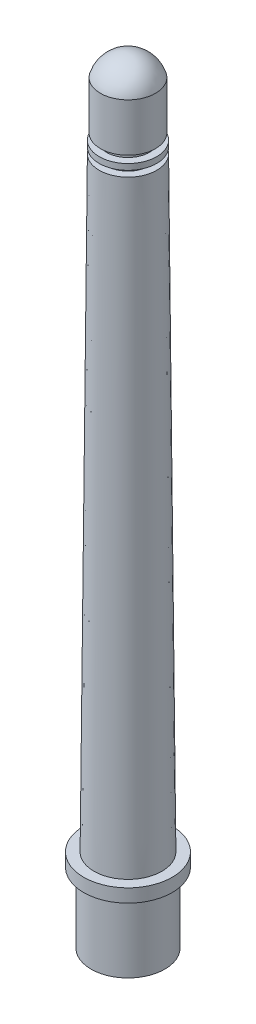
ISO-10303-21;
HEADER;
FILE_DESCRIPTION(('STEP AP214'),'2;1');
FILE_NAME('part.step','',(''),(''),'','','');
FILE_SCHEMA(('AUTOMOTIVE_DESIGN { 1 0 10303 214 1 1 1 1 }'));
ENDSEC;
DATA;
#1=APPLICATION_CONTEXT('core data for automotive mechanical design processes');
#2=APPLICATION_PROTOCOL_DEFINITION('international standard','automotive_design',2000,#1);
#3=PRODUCT_CONTEXT('',#1,'mechanical');
#4=PRODUCT('Part','Part','',(#3));
#5=PRODUCT_RELATED_PRODUCT_CATEGORY('part','',(#4));
#6=PRODUCT_DEFINITION_FORMATION('','',#4);
#7=PRODUCT_DEFINITION_CONTEXT('part definition',#1,'design');
#8=PRODUCT_DEFINITION('design','',#6,#7);
#9=PRODUCT_DEFINITION_SHAPE('','',#8);
#10=(LENGTH_UNIT() NAMED_UNIT(*) SI_UNIT(.MILLI.,.METRE.));
#11=(NAMED_UNIT(*) PLANE_ANGLE_UNIT() SI_UNIT($,.RADIAN.));
#12=(NAMED_UNIT(*) SI_UNIT($,.STERADIAN.) SOLID_ANGLE_UNIT());
#13=UNCERTAINTY_MEASURE_WITH_UNIT(LENGTH_MEASURE(1.E-05),#10,'distance_accuracy_value','');
#14=(GEOMETRIC_REPRESENTATION_CONTEXT(3) GLOBAL_UNCERTAINTY_ASSIGNED_CONTEXT((#13)) GLOBAL_UNIT_ASSIGNED_CONTEXT((#10,
#11,#12)) REPRESENTATION_CONTEXT('',''));
#15=CARTESIAN_POINT('',(0.,0.,0.));
#16=DIRECTION('',(0.,0.,1.));
#17=DIRECTION('',(1.,0.,0.));
#18=AXIS2_PLACEMENT_3D('',#15,#16,#17);
#19=CARTESIAN_POINT('',(-5.,-9.5,0.));
#20=DIRECTION('',(0.,-1.,0.));
#21=DIRECTION('',(0.,0.,-1.));
#22=AXIS2_PLACEMENT_3D('',#19,#20,#21);
#23=PLANE('',#22);
#24=CARTESIAN_POINT('',(0.,-9.49999999999999,0.));
#25=DIRECTION('',(0.,1.,0.));
#26=DIRECTION('',(0.,0.,1.));
#27=AXIS2_PLACEMENT_3D('',#24,#25,#26);
#28=CIRCLE('',#27,5.);
#29=CARTESIAN_POINT('',(0.,-9.49999999999999,5.));
#30=VERTEX_POINT('',#29);
#31=EDGE_CURVE('E10',#30,#30,#28,.T.);
#32=ORIENTED_EDGE('',*,*,#31,.F.);
#33=EDGE_LOOP('',(#32));
#34=FACE_BOUND('',#33,.T.);
#35=ADVANCED_FACE('F32',(#34),#23,.T.);
#36=CARTESIAN_POINT('',(0.,100.774977187123,0.));
#37=DIRECTION('',(0.,1.,0.));
#38=DIRECTION('',(0.,0.,1.));
#39=AXIS2_PLACEMENT_3D('',#36,#37,#38);
#40=CYLINDRICAL_SURFACE('',#39,5.);
#41=ORIENTED_EDGE('',*,*,#31,.T.);
#42=EDGE_LOOP('',(#41));
#43=FACE_BOUND('',#42,.T.);
#44=CARTESIAN_POINT('',(0.,0.,0.));
#45=DIRECTION('',(0.,1.,0.));
#46=DIRECTION('',(0.,0.,1.));
#47=AXIS2_PLACEMENT_3D('',#44,#45,#46);
#48=CIRCLE('',#47,5.);
#49=CARTESIAN_POINT('',(0.,0.,5.));
#50=VERTEX_POINT('',#49);
#51=EDGE_CURVE('E38',#50,#50,#48,.T.);
#52=ORIENTED_EDGE('',*,*,#51,.F.);
#53=EDGE_LOOP('',(#52));
#54=FACE_BOUND('',#53,.T.);
#55=ADVANCED_FACE('F98',(#43,#54),#40,.T.);
#56=CARTESIAN_POINT('',(-5.,0.,0.));
#57=DIRECTION('',(0.,-1.,0.));
#58=DIRECTION('',(0.,0.,-1.));
#59=AXIS2_PLACEMENT_3D('',#56,#57,#58);
#60=PLANE('',#59);
#61=ORIENTED_EDGE('',*,*,#51,.T.);
#62=EDGE_LOOP('',(#61));
#63=FACE_BOUND('',#62,.T.);
#64=CARTESIAN_POINT('',(0.,0.,0.));
#65=DIRECTION('',(0.,1.,0.));
#66=DIRECTION('',(0.,0.,1.));
#67=AXIS2_PLACEMENT_3D('',#64,#65,#66);
#68=CIRCLE('',#67,6.);
#69=CARTESIAN_POINT('',(0.,0.,6.));
#70=VERTEX_POINT('',#69);
#71=EDGE_CURVE('E42',#70,#70,#68,.T.);
#72=ORIENTED_EDGE('',*,*,#71,.F.);
#73=EDGE_LOOP('',(#72));
#74=FACE_BOUND('',#73,.T.);
#75=ADVANCED_FACE('F103',(#63,#74),#60,.T.);
#76=CARTESIAN_POINT('',(0.,100.774977187123,0.));
#77=DIRECTION('',(0.,1.,0.));
#78=DIRECTION('',(0.,0.,1.));
#79=AXIS2_PLACEMENT_3D('',#76,#77,#78);
#80=CYLINDRICAL_SURFACE('',#79,6.);
#81=ORIENTED_EDGE('',*,*,#71,.T.);
#82=EDGE_LOOP('',(#81));
#83=FACE_BOUND('',#82,.T.);
#84=CARTESIAN_POINT('',(0.,1.8,0.));
#85=DIRECTION('',(0.,1.,0.));
#86=DIRECTION('',(0.,0.,1.));
#87=AXIS2_PLACEMENT_3D('',#84,#85,#86);
#88=CIRCLE('',#87,6.);
#89=CARTESIAN_POINT('',(0.,1.8,6.));
#90=VERTEX_POINT('',#89);
#91=EDGE_CURVE('E46',#90,#90,#88,.T.);
#92=ORIENTED_EDGE('',*,*,#91,.F.);
#93=EDGE_LOOP('',(#92));
#94=FACE_BOUND('',#93,.T.);
#95=ADVANCED_FACE('F107',(#83,#94),#80,.T.);
#96=CARTESIAN_POINT('',(-6.,1.8,0.));
#97=DIRECTION('',(0.,1.,0.));
#98=DIRECTION('',(0.,0.,1.));
#99=AXIS2_PLACEMENT_3D('',#96,#97,#98);
#100=PLANE('',#99);
#101=ORIENTED_EDGE('',*,*,#91,.T.);
#102=EDGE_LOOP('',(#101));
#103=FACE_BOUND('',#102,.T.);
#104=CARTESIAN_POINT('',(0.,1.8,0.));
#105=DIRECTION('',(0.,1.,0.));
#106=DIRECTION('',(0.,0.,1.));
#107=AXIS2_PLACEMENT_3D('',#104,#105,#106);
#108=CIRCLE('',#107,4.6);
#109=CARTESIAN_POINT('',(0.,1.8,4.6));
#110=VERTEX_POINT('',#109);
#111=EDGE_CURVE('E51',#110,#110,#108,.T.);
#112=ORIENTED_EDGE('',*,*,#111,.F.);
#113=EDGE_LOOP('',(#112));
#114=FACE_BOUND('',#113,.T.);
#115=ADVANCED_FACE('F113',(#103,#114),#100,.T.);
#116=CARTESIAN_POINT('',(0.,83.8,0.));
#117=DIRECTION('',(0.,-1.,0.));
#118=DIRECTION('',(0.,0.,-1.));
#119=AXIS2_PLACEMENT_3D('',#116,#117,#118);
#120=CONICAL_SURFACE('',#119,3.9,0.00853637801190042);
#121=ORIENTED_EDGE('',*,*,#111,.T.);
#122=EDGE_LOOP('',(#121));
#123=FACE_BOUND('',#122,.T.);
#124=CARTESIAN_POINT('',(0.,83.8,0.));
#125=DIRECTION('',(0.,1.,0.));
#126=DIRECTION('',(0.,0.,1.));
#127=AXIS2_PLACEMENT_3D('',#124,#125,#126);
#128=CIRCLE('',#127,3.9);
#129=CARTESIAN_POINT('',(0.,83.8,3.9));
#130=VERTEX_POINT('',#129);
#131=EDGE_CURVE('E54',#130,#130,#128,.T.);
#132=ORIENTED_EDGE('',*,*,#131,.F.);
#133=EDGE_LOOP('',(#132));
#134=FACE_BOUND('',#133,.T.);
#135=ADVANCED_FACE('F117',(#123,#134),#120,.T.);
#136=CARTESIAN_POINT('',(-3.9,83.8,0.));
#137=DIRECTION('',(0.,1.,0.));
#138=DIRECTION('',(0.,0.,1.));
#139=AXIS2_PLACEMENT_3D('',#136,#137,#138);
#140=PLANE('',#139);
#141=ORIENTED_EDGE('',*,*,#131,.T.);
#142=EDGE_LOOP('',(#141));
#143=FACE_BOUND('',#142,.T.);
#144=CARTESIAN_POINT('',(0.,83.8,0.));
#145=DIRECTION('',(0.,1.,0.));
#146=DIRECTION('',(0.,0.,1.));
#147=AXIS2_PLACEMENT_3D('',#144,#145,#146);
#148=CIRCLE('',#147,2.9);
#149=CARTESIAN_POINT('',(0.,83.8,2.9));
#150=VERTEX_POINT('',#149);
#151=EDGE_CURVE('E57',#150,#150,#148,.T.);
#152=ORIENTED_EDGE('',*,*,#151,.F.);
#153=EDGE_LOOP('',(#152));
#154=FACE_BOUND('',#153,.T.);
#155=ADVANCED_FACE('F121',(#143,#154),#140,.T.);
#156=CARTESIAN_POINT('',(0.,100.774977187123,0.));
#157=DIRECTION('',(0.,1.,0.));
#158=DIRECTION('',(0.,0.,1.));
#159=AXIS2_PLACEMENT_3D('',#156,#157,#158);
#160=CYLINDRICAL_SURFACE('',#159,2.9);
#161=ORIENTED_EDGE('',*,*,#151,.T.);
#162=EDGE_LOOP('',(#161));
#163=FACE_BOUND('',#162,.T.);
#164=CARTESIAN_POINT('',(0.,84.6,0.));
#165=DIRECTION('',(0.,1.,0.));
#166=DIRECTION('',(0.,0.,1.));
#167=AXIS2_PLACEMENT_3D('',#164,#165,#166);
#168=CIRCLE('',#167,2.9);
#169=CARTESIAN_POINT('',(0.,84.6,2.9));
#170=VERTEX_POINT('',#169);
#171=EDGE_CURVE('E60',#170,#170,#168,.T.);
#172=ORIENTED_EDGE('',*,*,#171,.F.);
#173=EDGE_LOOP('',(#172));
#174=FACE_BOUND('',#173,.T.);
#175=ADVANCED_FACE('F125',(#163,#174),#160,.T.);
#176=CARTESIAN_POINT('',(-3.9,84.6,0.));
#177=DIRECTION('',(0.,-1.,0.));
#178=DIRECTION('',(0.,0.,-1.));
#179=AXIS2_PLACEMENT_3D('',#176,#177,#178);
#180=PLANE('',#179);
#181=ORIENTED_EDGE('',*,*,#171,.T.);
#182=EDGE_LOOP('',(#181));
#183=FACE_BOUND('',#182,.T.);
#184=CARTESIAN_POINT('',(0.,84.6,0.));
#185=DIRECTION('',(0.,1.,0.));
#186=DIRECTION('',(0.,0.,1.));
#187=AXIS2_PLACEMENT_3D('',#184,#185,#186);
#188=CIRCLE('',#187,3.9);
#189=CARTESIAN_POINT('',(0.,84.6,3.9));
#190=VERTEX_POINT('',#189);
#191=EDGE_CURVE('E63',#190,#190,#188,.T.);
#192=ORIENTED_EDGE('',*,*,#191,.F.);
#193=EDGE_LOOP('',(#192));
#194=FACE_BOUND('',#193,.T.);
#195=ADVANCED_FACE('F129',(#183,#194),#180,.T.);
#196=CARTESIAN_POINT('',(0.,100.774977187123,0.));
#197=DIRECTION('',(0.,1.,0.));
#198=DIRECTION('',(0.,0.,1.));
#199=AXIS2_PLACEMENT_3D('',#196,#197,#198);
#200=CYLINDRICAL_SURFACE('',#199,3.9);
#201=ORIENTED_EDGE('',*,*,#191,.T.);
#202=EDGE_LOOP('',(#201));
#203=FACE_BOUND('',#202,.T.);
#204=CARTESIAN_POINT('',(0.,85.4,0.));
#205=DIRECTION('',(0.,1.,0.));
#206=DIRECTION('',(0.,0.,1.));
#207=AXIS2_PLACEMENT_3D('',#204,#205,#206);
#208=CIRCLE('',#207,3.9);
#209=CARTESIAN_POINT('',(0.,85.4,3.9));
#210=VERTEX_POINT('',#209);
#211=EDGE_CURVE('E66',#210,#210,#208,.T.);
#212=ORIENTED_EDGE('',*,*,#211,.F.);
#213=EDGE_LOOP('',(#212));
#214=FACE_BOUND('',#213,.T.);
#215=ADVANCED_FACE('F133',(#203,#214),#200,.T.);
#216=CARTESIAN_POINT('',(-2.9,85.4,0.));
#217=DIRECTION('',(0.,1.,0.));
#218=DIRECTION('',(0.,0.,1.));
#219=AXIS2_PLACEMENT_3D('',#216,#217,#218);
#220=PLANE('',#219);
#221=ORIENTED_EDGE('',*,*,#211,.T.);
#222=EDGE_LOOP('',(#221));
#223=FACE_BOUND('',#222,.T.);
#224=CARTESIAN_POINT('',(0.,85.4,0.));
#225=DIRECTION('',(0.,1.,0.));
#226=DIRECTION('',(0.,0.,1.));
#227=AXIS2_PLACEMENT_3D('',#224,#225,#226);
#228=CIRCLE('',#227,2.9);
#229=CARTESIAN_POINT('',(0.,85.4,2.9));
#230=VERTEX_POINT('',#229);
#231=EDGE_CURVE('E69',#230,#230,#228,.T.);
#232=ORIENTED_EDGE('',*,*,#231,.F.);
#233=EDGE_LOOP('',(#232));
#234=FACE_BOUND('',#233,.T.);
#235=ADVANCED_FACE('F137',(#223,#234),#220,.T.);
#236=CARTESIAN_POINT('',(0.,100.774977187123,0.));
#237=DIRECTION('',(0.,1.,0.));
#238=DIRECTION('',(0.,0.,1.));
#239=AXIS2_PLACEMENT_3D('',#236,#237,#238);
#240=CYLINDRICAL_SURFACE('',#239,2.9);
#241=ORIENTED_EDGE('',*,*,#231,.T.);
#242=EDGE_LOOP('',(#241));
#243=FACE_BOUND('',#242,.T.);
#244=CARTESIAN_POINT('',(0.,86.2587885409378,0.));
#245=DIRECTION('',(0.,1.,0.));
#246=DIRECTION('',(0.,0.,1.));
#247=AXIS2_PLACEMENT_3D('',#244,#245,#246);
#248=CIRCLE('',#247,2.9);
#249=CARTESIAN_POINT('',(0.,86.2587885409378,2.9));
#250=VERTEX_POINT('',#249);
#251=EDGE_CURVE('E72',#250,#250,#248,.T.);
#252=ORIENTED_EDGE('',*,*,#251,.F.);
#253=EDGE_LOOP('',(#252));
#254=FACE_BOUND('',#253,.T.);
#255=ADVANCED_FACE('F94',(#243,#254),#240,.T.);
#256=CARTESIAN_POINT('',(-2.9,86.2587885409378,0.));
#257=DIRECTION('',(0.,-1.,0.));
#258=DIRECTION('',(0.,0.,-1.));
#259=AXIS2_PLACEMENT_3D('',#256,#257,#258);
#260=PLANE('',#259);
#261=ORIENTED_EDGE('',*,*,#251,.T.);
#262=EDGE_LOOP('',(#261));
#263=FACE_BOUND('',#262,.T.);
#264=CARTESIAN_POINT('',(0.,86.2587885409378,0.));
#265=DIRECTION('',(0.,1.,0.));
#266=DIRECTION('',(0.,0.,1.));
#267=AXIS2_PLACEMENT_3D('',#264,#265,#266);
#268=CIRCLE('',#267,3.73509107576064);
#269=CARTESIAN_POINT('',(0.,86.2587885409378,3.73509107576064));
#270=VERTEX_POINT('',#269);
#271=EDGE_CURVE('E75',#270,#270,#268,.T.);
#272=ORIENTED_EDGE('',*,*,#271,.F.);
#273=EDGE_LOOP('',(#272));
#274=FACE_BOUND('',#273,.T.);
#275=ADVANCED_FACE('F86',(#263,#274),#260,.T.);
#276=CARTESIAN_POINT('',(0.,100.774977187123,0.));
#277=DIRECTION('',(0.,1.,0.));
#278=DIRECTION('',(0.,0.,1.));
#279=AXIS2_PLACEMENT_3D('',#276,#277,#278);
#280=CYLINDRICAL_SURFACE('',#279,3.73509107576064);
#281=ORIENTED_EDGE('',*,*,#271,.T.);
#282=EDGE_LOOP('',(#281));
#283=FACE_BOUND('',#282,.T.);
#284=CARTESIAN_POINT('',(0.,92.7587885409378,0.));
#285=DIRECTION('',(0.,1.,0.));
#286=DIRECTION('',(0.,0.,1.));
#287=AXIS2_PLACEMENT_3D('',#284,#285,#286);
#288=CIRCLE('',#287,3.73509107576064);
#289=CARTESIAN_POINT('',(0.,92.7587885409378,3.73509107576064));
#290=VERTEX_POINT('',#289);
#291=EDGE_CURVE('E78',#290,#290,#288,.T.);
#292=ORIENTED_EDGE('',*,*,#291,.F.);
#293=EDGE_LOOP('',(#292));
#294=FACE_BOUND('',#293,.T.);
#295=ADVANCED_FACE('F84',(#283,#294),#280,.T.);
#296=CARTESIAN_POINT('',(0.,91.7075573602896,0.));
#297=DIRECTION('',(0.,1.,0.));
#298=DIRECTION('',(-1.,0.,0.));
#299=AXIS2_PLACEMENT_3D('',#296,#297,#298);
#300=SPHERICAL_SURFACE('',#299,3.88020519294968);
#301=ORIENTED_EDGE('',*,*,#291,.T.);
#302=EDGE_LOOP('',(#301));
#303=FACE_BOUND('',#302,.T.);
#304=ADVANCED_FACE('F82',(#303),#300,.T.);
#305=CLOSED_SHELL('',(#35,#55,#75,#95,#115,#135,#155,#175,#195,#215,#235,#255,#275,#295,#304));
#306=MANIFOLD_SOLID_BREP('B2',#305);
#307=ADVANCED_BREP_SHAPE_REPRESENTATION('',(#18,#306),#14);
#308=SHAPE_DEFINITION_REPRESENTATION(#9,#307);
ENDSEC;
END-ISO-10303-21;
